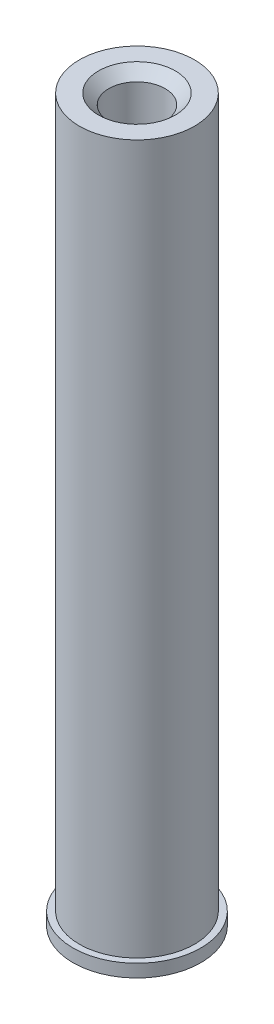
ISO-10303-21;
HEADER;
FILE_DESCRIPTION(('STEP AP214'),'2;1');
FILE_NAME('part.step','',(''),(''),'','','');
FILE_SCHEMA(('AUTOMOTIVE_DESIGN { 1 0 10303 214 1 1 1 1 }'));
ENDSEC;
DATA;
#1=APPLICATION_CONTEXT('core data for automotive mechanical design processes');
#2=APPLICATION_PROTOCOL_DEFINITION('international standard','automotive_design',2000,#1);
#3=PRODUCT_CONTEXT('',#1,'mechanical');
#4=PRODUCT('Part','Part','',(#3));
#5=PRODUCT_RELATED_PRODUCT_CATEGORY('part','',(#4));
#6=PRODUCT_DEFINITION_FORMATION('','',#4);
#7=PRODUCT_DEFINITION_CONTEXT('part definition',#1,'design');
#8=PRODUCT_DEFINITION('design','',#6,#7);
#9=PRODUCT_DEFINITION_SHAPE('','',#8);
#10=(LENGTH_UNIT() NAMED_UNIT(*) SI_UNIT(.MILLI.,.METRE.));
#11=(NAMED_UNIT(*) PLANE_ANGLE_UNIT() SI_UNIT($,.RADIAN.));
#12=(NAMED_UNIT(*) SI_UNIT($,.STERADIAN.) SOLID_ANGLE_UNIT());
#13=UNCERTAINTY_MEASURE_WITH_UNIT(LENGTH_MEASURE(1.E-05),#10,'distance_accuracy_value','');
#14=(GEOMETRIC_REPRESENTATION_CONTEXT(3) GLOBAL_UNCERTAINTY_ASSIGNED_CONTEXT((#13)) GLOBAL_UNIT_ASSIGNED_CONTEXT((#10,
#11,#12)) REPRESENTATION_CONTEXT('',''));
#15=CARTESIAN_POINT('',(0.,0.,0.));
#16=DIRECTION('',(0.,0.,1.));
#17=DIRECTION('',(1.,0.,0.));
#18=AXIS2_PLACEMENT_3D('',#15,#16,#17);
#19=CARTESIAN_POINT('',(0.,0.5,0.));
#20=DIRECTION('',(0.,-1.,0.));
#21=DIRECTION('',(0.,0.,-1.));
#22=AXIS2_PLACEMENT_3D('',#19,#20,#21);
#23=CYLINDRICAL_SURFACE('',#22,2.5);
#24=CARTESIAN_POINT('',(0.,0.5,0.));
#25=DIRECTION('',(0.,1.,0.));
#26=DIRECTION('',(0.,0.,1.));
#27=AXIS2_PLACEMENT_3D('',#24,#25,#26);
#28=CIRCLE('',#27,2.5);
#29=CARTESIAN_POINT('',(0.,0.5,2.5));
#30=VERTEX_POINT('',#29);
#31=EDGE_CURVE('E52',#30,#30,#28,.T.);
#32=ORIENTED_EDGE('',*,*,#31,.F.);
#33=EDGE_LOOP('',(#32));
#34=FACE_BOUND('',#33,.T.);
#35=CARTESIAN_POINT('',(0.,0.,0.));
#36=DIRECTION('',(0.,1.,0.));
#37=DIRECTION('',(0.,0.,1.));
#38=AXIS2_PLACEMENT_3D('',#35,#36,#37);
#39=CIRCLE('',#38,2.5);
#40=CARTESIAN_POINT('',(0.,0.,2.5));
#41=VERTEX_POINT('',#40);
#42=EDGE_CURVE('E48',#41,#41,#39,.T.);
#43=ORIENTED_EDGE('',*,*,#42,.T.);
#44=EDGE_LOOP('',(#43));
#45=FACE_BOUND('',#44,.T.);
#46=ADVANCED_FACE('F44',(#34,#45),#23,.T.);
#47=CARTESIAN_POINT('',(0.,0.5,0.));
#48=DIRECTION('',(0.,1.,0.));
#49=DIRECTION('',(0.,0.,1.));
#50=AXIS2_PLACEMENT_3D('',#47,#48,#49);
#51=PLANE('',#50);
#52=CARTESIAN_POINT('',(0.,0.5,0.));
#53=DIRECTION('',(0.,1.,0.));
#54=DIRECTION('',(0.,0.,1.));
#55=AXIS2_PLACEMENT_3D('',#52,#53,#54);
#56=CIRCLE('',#55,2.25);
#57=CARTESIAN_POINT('',(0.,0.5,2.25));
#58=VERTEX_POINT('',#57);
#59=EDGE_CURVE('E11',#58,#58,#56,.T.);
#60=ORIENTED_EDGE('',*,*,#59,.F.);
#61=EDGE_LOOP('',(#60));
#62=FACE_BOUND('',#61,.T.);
#63=ORIENTED_EDGE('',*,*,#31,.T.);
#64=EDGE_LOOP('',(#63));
#65=FACE_BOUND('',#64,.T.);
#66=ADVANCED_FACE('F93',(#62,#65),#51,.T.);
#67=CARTESIAN_POINT('',(0.,0.,0.));
#68=DIRECTION('',(0.,1.,0.));
#69=DIRECTION('',(0.,0.,1.));
#70=AXIS2_PLACEMENT_3D('',#67,#68,#69);
#71=PLANE('',#70);
#72=ORIENTED_EDGE('',*,*,#42,.F.);
#73=EDGE_LOOP('',(#72));
#74=FACE_BOUND('',#73,.T.);
#75=ADVANCED_FACE('F86',(#74),#71,.F.);
#76=CARTESIAN_POINT('',(0.,28.2,0.));
#77=DIRECTION('',(0.,-1.,0.));
#78=DIRECTION('',(0.,0.,-1.));
#79=AXIS2_PLACEMENT_3D('',#76,#77,#78);
#80=CYLINDRICAL_SURFACE('',#79,2.25);
#81=CARTESIAN_POINT('',(0.,28.2,0.));
#82=DIRECTION('',(0.,1.,0.));
#83=DIRECTION('',(0.,0.,1.));
#84=AXIS2_PLACEMENT_3D('',#81,#82,#83);
#85=CIRCLE('',#84,2.25);
#86=CARTESIAN_POINT('',(0.,28.2,2.25));
#87=VERTEX_POINT('',#86);
#88=EDGE_CURVE('E66',#87,#87,#85,.T.);
#89=ORIENTED_EDGE('',*,*,#88,.F.);
#90=EDGE_LOOP('',(#89));
#91=FACE_BOUND('',#90,.T.);
#92=ORIENTED_EDGE('',*,*,#59,.T.);
#93=EDGE_LOOP('',(#92));
#94=FACE_BOUND('',#93,.T.);
#95=ADVANCED_FACE('F89',(#91,#94),#80,.T.);
#96=CARTESIAN_POINT('',(0.,28.2,0.));
#97=DIRECTION('',(0.,1.,0.));
#98=DIRECTION('',(0.,0.,1.));
#99=AXIS2_PLACEMENT_3D('',#96,#97,#98);
#100=PLANE('',#99);
#101=CARTESIAN_POINT('',(0.,28.2,0.));
#102=DIRECTION('',(0.,1.,0.));
#103=DIRECTION('',(0.,0.,1.));
#104=AXIS2_PLACEMENT_3D('',#101,#102,#103);
#105=CIRCLE('',#104,1.5);
#106=CARTESIAN_POINT('',(0.,28.2,1.5));
#107=VERTEX_POINT('',#106);
#108=EDGE_CURVE('E77',#107,#107,#105,.T.);
#109=ORIENTED_EDGE('',*,*,#108,.F.);
#110=EDGE_LOOP('',(#109));
#111=FACE_BOUND('',#110,.T.);
#112=ORIENTED_EDGE('',*,*,#88,.T.);
#113=EDGE_LOOP('',(#112));
#114=FACE_BOUND('',#113,.T.);
#115=ADVANCED_FACE('F62',(#111,#114),#100,.T.);
#116=CARTESIAN_POINT('',(0.,18.8609466809303,0.));
#117=DIRECTION('',(0.,1.,0.));
#118=DIRECTION('',(0.,0.,1.));
#119=AXIS2_PLACEMENT_3D('',#116,#117,#118);
#120=CONICAL_SURFACE('',#119,1.1,1.02974425867665);
#121=CARTESIAN_POINT('',(0.,18.2,0.));
#122=VERTEX_POINT('',#121);
#123=VERTEX_LOOP('',#122);
#124=FACE_BOUND('',#123,.T.);
#125=CARTESIAN_POINT('',(0.,18.8609466809303,0.));
#126=DIRECTION('',(0.,1.,0.));
#127=DIRECTION('',(0.,0.,1.));
#128=AXIS2_PLACEMENT_3D('',#125,#126,#127);
#129=CIRCLE('',#128,1.1);
#130=CARTESIAN_POINT('',(0.,18.8609466809303,1.1));
#131=VERTEX_POINT('',#130);
#132=EDGE_CURVE('E63',#131,#131,#129,.T.);
#133=ORIENTED_EDGE('',*,*,#132,.T.);
#134=EDGE_LOOP('',(#133));
#135=FACE_BOUND('',#134,.T.);
#136=ADVANCED_FACE('F60',(#124,#135),#120,.F.);
#137=CARTESIAN_POINT('',(0.,28.2,0.));
#138=DIRECTION('',(0.,1.,0.));
#139=DIRECTION('',(0.,0.,1.));
#140=AXIS2_PLACEMENT_3D('',#137,#138,#139);
#141=CYLINDRICAL_SURFACE('',#140,1.1);
#142=ORIENTED_EDGE('',*,*,#132,.F.);
#143=EDGE_LOOP('',(#142));
#144=FACE_BOUND('',#143,.T.);
#145=CARTESIAN_POINT('',(0.,27.8,0.));
#146=DIRECTION('',(0.,1.,0.));
#147=DIRECTION('',(0.,0.,1.));
#148=AXIS2_PLACEMENT_3D('',#145,#146,#147);
#149=CIRCLE('',#148,1.1);
#150=CARTESIAN_POINT('',(0.,27.8,1.1));
#151=VERTEX_POINT('',#150);
#152=EDGE_CURVE('E67',#151,#151,#149,.T.);
#153=ORIENTED_EDGE('',*,*,#152,.T.);
#154=EDGE_LOOP('',(#153));
#155=FACE_BOUND('',#154,.T.);
#156=ADVANCED_FACE('F58',(#144,#155),#141,.F.);
#157=CARTESIAN_POINT('',(0.,28.2,0.));
#158=DIRECTION('',(0.,1.,0.));
#159=DIRECTION('',(0.,0.,1.));
#160=AXIS2_PLACEMENT_3D('',#157,#158,#159);
#161=CONICAL_SURFACE('',#160,1.5,0.785398163397448);
#162=ORIENTED_EDGE('',*,*,#152,.F.);
#163=EDGE_LOOP('',(#162));
#164=FACE_BOUND('',#163,.T.);
#165=ORIENTED_EDGE('',*,*,#108,.T.);
#166=EDGE_LOOP('',(#165));
#167=FACE_BOUND('',#166,.T.);
#168=ADVANCED_FACE('F144',(#164,#167),#161,.F.);
#169=CLOSED_SHELL('',(#46,#66,#75,#95,#115,#136,#156,#168));
#170=MANIFOLD_SOLID_BREP('B2',#169);
#171=ADVANCED_BREP_SHAPE_REPRESENTATION('',(#18,#170),#14);
#172=SHAPE_DEFINITION_REPRESENTATION(#9,#171);
ENDSEC;
END-ISO-10303-21;
